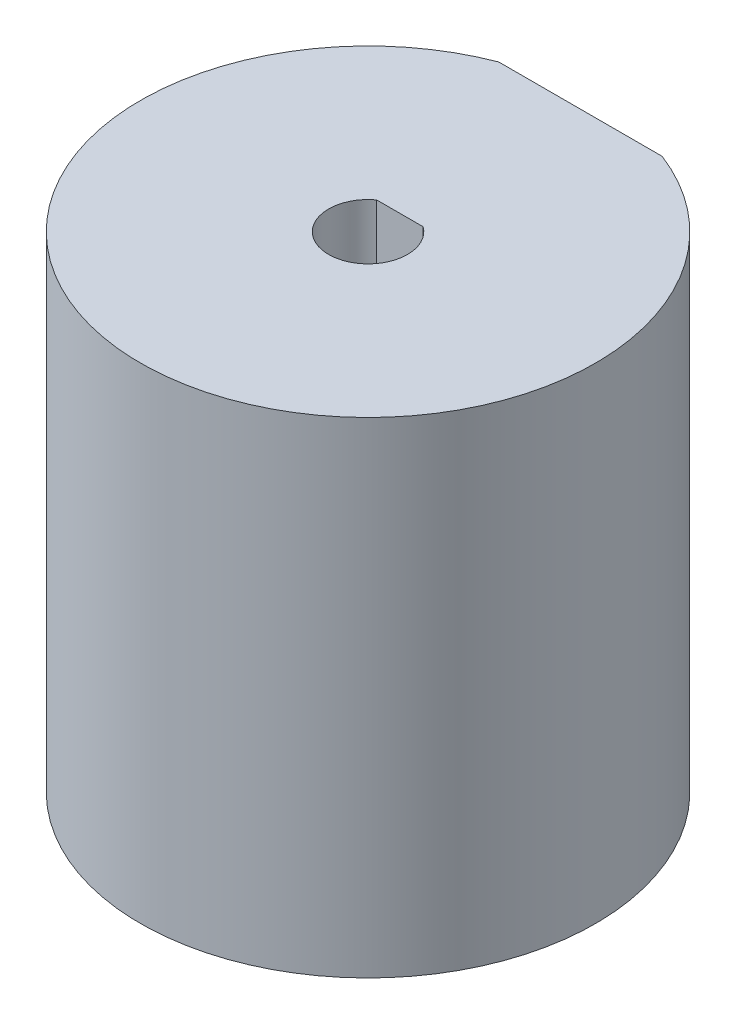
ISO-10303-21;
HEADER;
FILE_DESCRIPTION(('STEP AP214'),'2;1');
FILE_NAME('part.step','',(''),(''),'','','');
FILE_SCHEMA(('AUTOMOTIVE_DESIGN { 1 0 10303 214 1 1 1 1 }'));
ENDSEC;
DATA;
#1=APPLICATION_CONTEXT('core data for automotive mechanical design processes');
#2=APPLICATION_PROTOCOL_DEFINITION('international standard','automotive_design',2000,#1);
#3=PRODUCT_CONTEXT('',#1,'mechanical');
#4=PRODUCT('Part','Part','',(#3));
#5=PRODUCT_RELATED_PRODUCT_CATEGORY('part','',(#4));
#6=PRODUCT_DEFINITION_FORMATION('','',#4);
#7=PRODUCT_DEFINITION_CONTEXT('part definition',#1,'design');
#8=PRODUCT_DEFINITION('design','',#6,#7);
#9=PRODUCT_DEFINITION_SHAPE('','',#8);
#10=(LENGTH_UNIT() NAMED_UNIT(*) SI_UNIT(.MILLI.,.METRE.));
#11=(NAMED_UNIT(*) PLANE_ANGLE_UNIT() SI_UNIT($,.RADIAN.));
#12=(NAMED_UNIT(*) SI_UNIT($,.STERADIAN.) SOLID_ANGLE_UNIT());
#13=UNCERTAINTY_MEASURE_WITH_UNIT(LENGTH_MEASURE(1.E-05),#10,'distance_accuracy_value','');
#14=(GEOMETRIC_REPRESENTATION_CONTEXT(3) GLOBAL_UNCERTAINTY_ASSIGNED_CONTEXT((#13)) GLOBAL_UNIT_ASSIGNED_CONTEXT((#10,
#11,#12)) REPRESENTATION_CONTEXT('',''));
#15=CARTESIAN_POINT('',(0.,0.,0.));
#16=DIRECTION('',(0.,0.,1.));
#17=DIRECTION('',(1.,0.,0.));
#18=AXIS2_PLACEMENT_3D('',#15,#16,#17);
#19=CARTESIAN_POINT('',(0.,-2.5,-1.1));
#20=DIRECTION('',(0.,0.,-1.));
#21=DIRECTION('',(-1.,0.,0.));
#22=AXIS2_PLACEMENT_3D('',#19,#20,#21);
#23=CYLINDRICAL_SURFACE('',#22,1.6);
#24=CARTESIAN_POINT('',(0.,-2.5,-2.1));
#25=DIRECTION('',(0.,0.,-1.));
#26=DIRECTION('',(-1.,0.,0.));
#27=AXIS2_PLACEMENT_3D('',#24,#25,#26);
#28=CIRCLE('',#27,1.6);
#29=CARTESIAN_POINT('',(-1.53297097167559,-2.95825756949558,-2.1));
#30=VERTEX_POINT('',#29);
#31=CARTESIAN_POINT('',(1.53297097167559,-2.95825756949558,-2.1));
#32=VERTEX_POINT('',#31);
#33=EDGE_CURVE('E118',#30,#32,#28,.F.);
#34=ORIENTED_EDGE('',*,*,#33,.T.);
#35=CARTESIAN_POINT('',(1.53297097167559,-2.95825756949558,-2.1));
#36=CARTESIAN_POINT('',(1.54352604971187,-2.92294277650061,-2.09229272245643));
#37=CARTESIAN_POINT('',(1.55290301607243,-2.88712669403318,-2.08532865621752));
#38=CARTESIAN_POINT('',(1.56920034496131,-2.81463580797291,-2.07309299418957));
#39=CARTESIAN_POINT('',(1.57611926253637,-2.77796051275257,-2.06782239407064));
#40=CARTESIAN_POINT('',(1.59266855904081,-2.66924419230056,-2.05514314988246));
#41=CARTESIAN_POINT('',(1.59876147888326,-2.59627664989198,-2.05036122601527));
#42=CARTESIAN_POINT('',(1.60042058239588,-2.48300068282727,-2.04905949733274));
#43=CARTESIAN_POINT('',(1.59948109076205,-2.44271373665959,-2.04979705662415));
#44=CARTESIAN_POINT('',(1.59457907462669,-2.36240256378808,-2.05361367963773));
#45=CARTESIAN_POINT('',(1.5906149828767,-2.32237848414101,-2.05669395727699));
#46=CARTESIAN_POINT('',(1.5795421687225,-2.24161055241428,-2.06521139890993));
#47=CARTESIAN_POINT('',(1.57232986576967,-2.2008893712361,-2.0707260665678));
#48=CARTESIAN_POINT('',(1.55488226138408,-2.120476482756,-2.08385505850354));
#49=CARTESIAN_POINT('',(1.54464930479004,-2.08078400280795,-2.09146775384516));
#50=CARTESIAN_POINT('',(1.53297097167559,-2.04174243050442,-2.1));
#51=B_SPLINE_CURVE_WITH_KNOTS('',3,(#35,#36,#37,#38,#39,#40,#41,#42,#43,#44,#45,#46,#47,#48,#49,
#50),.UNSPECIFIED.,.F.,.F.,(4,2,2,2,2,2,2,4),(0.,0.112906588055111,0.225879438358299,
0.444746434931626,0.565508297489338,0.686332777410956,0.811317666956803,0.936205788655623),.UNSPECIFIED.);
#52=CARTESIAN_POINT('',(1.53297097167559,-2.04174243050441,-2.1));
#53=VERTEX_POINT('',#52);
#54=EDGE_CURVE('E51',#32,#53,#51,.T.);
#55=ORIENTED_EDGE('',*,*,#54,.T.);
#56=CARTESIAN_POINT('',(-1.53297097167559,-2.04174243050441,-2.1));
#57=VERTEX_POINT('',#56);
#58=EDGE_CURVE('E109',#53,#57,#28,.F.);
#59=ORIENTED_EDGE('',*,*,#58,.T.);
#60=CARTESIAN_POINT('',(-1.53297097167559,-2.04174243050441,-2.1));
#61=CARTESIAN_POINT('',(-1.54352604971187,-2.07705722349938,-2.09229272245643));
#62=CARTESIAN_POINT('',(-1.55290301607243,-2.11287330596682,-2.08532865621752));
#63=CARTESIAN_POINT('',(-1.56920034496131,-2.18536419202708,-2.07309299418958));
#64=CARTESIAN_POINT('',(-1.57611926253637,-2.22203948724742,-2.06782239407064));
#65=CARTESIAN_POINT('',(-1.59266855904081,-2.33075580769943,-2.05514314988247));
#66=CARTESIAN_POINT('',(-1.59876147888326,-2.40372335010801,-2.05036122601527));
#67=CARTESIAN_POINT('',(-1.60042058239588,-2.51699931717272,-2.04905949733274));
#68=CARTESIAN_POINT('',(-1.59948109076205,-2.5572862633404,-2.04979705662415));
#69=CARTESIAN_POINT('',(-1.59457907462669,-2.63759743621192,-2.05361367963773));
#70=CARTESIAN_POINT('',(-1.5906149828767,-2.67762151585898,-2.05669395727699));
#71=CARTESIAN_POINT('',(-1.5795421687225,-2.75838944758571,-2.06521139890993));
#72=CARTESIAN_POINT('',(-1.57232986576967,-2.7991106287639,-2.0707260665678));
#73=CARTESIAN_POINT('',(-1.55488226138408,-2.879523517244,-2.08385505850354));
#74=CARTESIAN_POINT('',(-1.54464930479004,-2.91921599719205,-2.09146775384516));
#75=CARTESIAN_POINT('',(-1.53297097167559,-2.95825756949558,-2.1));
#76=B_SPLINE_CURVE_WITH_KNOTS('',3,(#60,#61,#62,#63,#64,#65,#66,#67,#68,#69,#70,#71,#72,#73,#74,
#75),.UNSPECIFIED.,.F.,.F.,(4,2,2,2,2,2,2,4),(0.,0.112906588055112,0.225879438358298,
0.444746434931625,0.565508297489338,0.686332777410958,0.811317666956805,0.936205788655627),.UNSPECIFIED.);
#77=EDGE_CURVE('E112',#57,#30,#76,.T.);
#78=ORIENTED_EDGE('',*,*,#77,.T.);
#79=EDGE_LOOP('',(#34,#55,#59,#78));
#80=FACE_BOUND('',#79,.T.);
#81=CARTESIAN_POINT('',(0.,-2.5,-7.));
#82=DIRECTION('',(0.,0.,-1.));
#83=DIRECTION('',(-1.,0.,0.));
#84=AXIS2_PLACEMENT_3D('',#81,#82,#83);
#85=CIRCLE('',#84,1.6);
#86=CARTESIAN_POINT('',(-1.6,-2.5,-7.));
#87=VERTEX_POINT('',#86);
#88=EDGE_CURVE('E39',#87,#87,#85,.T.);
#89=ORIENTED_EDGE('',*,*,#88,.T.);
#90=EDGE_LOOP('',(#89));
#91=FACE_BOUND('',#90,.T.);
#92=ADVANCED_FACE('F35',(#80,#91),#23,.F.);
#93=CARTESIAN_POINT('',(0.,0.,0.));
#94=DIRECTION('',(0.,1.,0.));
#95=DIRECTION('',(0.,0.,1.));
#96=AXIS2_PLACEMENT_3D('',#93,#94,#95);
#97=CYLINDRICAL_SURFACE('',#96,2.6);
#98=ORIENTED_EDGE('',*,*,#54,.F.);
#99=DIRECTION('',(0.,1.,0.));
#100=VECTOR('',#99,1.);
#101=CARTESIAN_POINT('',(1.53297097167559,0.,-2.1));
#102=LINE('',#101,#100);
#103=CARTESIAN_POINT('',(1.53297097167559,-10.,-2.1));
#104=VERTEX_POINT('',#103);
#105=EDGE_CURVE('E131',#104,#32,#102,.T.);
#106=ORIENTED_EDGE('',*,*,#105,.F.);
#107=CARTESIAN_POINT('',(0.,-10.,0.));
#108=DIRECTION('',(0.,1.,0.));
#109=DIRECTION('',(0.,0.,1.));
#110=AXIS2_PLACEMENT_3D('',#107,#108,#109);
#111=CIRCLE('',#110,2.6);
#112=CARTESIAN_POINT('',(-1.53297097167559,-10.,-2.1));
#113=VERTEX_POINT('',#112);
#114=EDGE_CURVE('E146',#113,#104,#111,.T.);
#115=ORIENTED_EDGE('',*,*,#114,.F.);
#116=DIRECTION('',(0.,1.,0.));
#117=VECTOR('',#116,1.);
#118=CARTESIAN_POINT('',(-1.53297097167559,0.,-2.1));
#119=LINE('',#118,#117);
#120=EDGE_CURVE('E44',#113,#30,#119,.T.);
#121=ORIENTED_EDGE('',*,*,#120,.T.);
#122=ORIENTED_EDGE('',*,*,#77,.F.);
#123=CARTESIAN_POINT('',(-1.53297097167559,5.,-2.1));
#124=VERTEX_POINT('',#123);
#125=EDGE_CURVE('E123',#57,#124,#119,.T.);
#126=ORIENTED_EDGE('',*,*,#125,.T.);
#127=CARTESIAN_POINT('',(0.,5.,0.));
#128=DIRECTION('',(0.,1.,0.));
#129=DIRECTION('',(0.,0.,1.));
#130=AXIS2_PLACEMENT_3D('',#127,#128,#129);
#131=CIRCLE('',#130,2.6);
#132=CARTESIAN_POINT('',(1.53297097167559,5.,-2.1));
#133=VERTEX_POINT('',#132);
#134=EDGE_CURVE('E138',#124,#133,#131,.T.);
#135=ORIENTED_EDGE('',*,*,#134,.T.);
#136=EDGE_CURVE('E134',#53,#133,#102,.T.);
#137=ORIENTED_EDGE('',*,*,#136,.F.);
#138=EDGE_LOOP('',(#98,#106,#115,#121,#122,#126,#135,#137));
#139=FACE_BOUND('',#138,.T.);
#140=ADVANCED_FACE('F121',(#139),#97,.F.);
#141=CARTESIAN_POINT('',(1.53297097167559,0.,-2.1));
#142=DIRECTION('',(0.,0.,-1.));
#143=DIRECTION('',(-1.,0.,0.));
#144=AXIS2_PLACEMENT_3D('',#141,#142,#143);
#145=PLANE('',#144);
#146=ORIENTED_EDGE('',*,*,#33,.F.);
#147=ORIENTED_EDGE('',*,*,#120,.F.);
#148=DIRECTION('',(-1.,0.,0.));
#149=VECTOR('',#148,1.);
#150=CARTESIAN_POINT('',(1.53297097167559,-10.,-2.1));
#151=LINE('',#150,#149);
#152=EDGE_CURVE('E143',#104,#113,#151,.T.);
#153=ORIENTED_EDGE('',*,*,#152,.F.);
#154=ORIENTED_EDGE('',*,*,#105,.T.);
#155=EDGE_LOOP('',(#146,#147,#153,#154));
#156=FACE_BOUND('',#155,.T.);
#157=ADVANCED_FACE('F239',(#156),#145,.F.);
#158=CARTESIAN_POINT('',(0.,-10.,0.));
#159=DIRECTION('',(0.,1.,0.));
#160=DIRECTION('',(0.,0.,1.));
#161=AXIS2_PLACEMENT_3D('',#158,#159,#160);
#162=CYLINDRICAL_SURFACE('',#161,15.);
#163=CARTESIAN_POINT('',(0.,5.,0.));
#164=DIRECTION('',(0.,1.,0.));
#165=DIRECTION('',(0.,0.,1.));
#166=AXIS2_PLACEMENT_3D('',#163,#164,#165);
#167=CIRCLE('',#166,15.);
#168=CARTESIAN_POINT('',(-5.38516480713451,5.,-14.));
#169=VERTEX_POINT('',#168);
#170=CARTESIAN_POINT('',(5.38516480713451,5.,-14.));
#171=VERTEX_POINT('',#170);
#172=EDGE_CURVE('E140',#169,#171,#167,.T.);
#173=ORIENTED_EDGE('',*,*,#172,.F.);
#174=DIRECTION('',(0.,1.,0.));
#175=VECTOR('',#174,1.);
#176=CARTESIAN_POINT('',(-5.38516480713451,-46.,-14.));
#177=LINE('',#176,#175);
#178=CARTESIAN_POINT('',(-5.38516480713451,-27.,-14.));
#179=VERTEX_POINT('',#178);
#180=EDGE_CURVE('E174',#179,#169,#177,.T.);
#181=ORIENTED_EDGE('',*,*,#180,.F.);
#182=CARTESIAN_POINT('',(0.,-27.,0.));
#183=DIRECTION('',(0.,-1.,0.));
#184=DIRECTION('',(0.,0.,-1.));
#185=AXIS2_PLACEMENT_3D('',#182,#183,#184);
#186=CIRCLE('',#185,15.);
#187=CARTESIAN_POINT('',(5.38516480713451,-27.,-14.));
#188=VERTEX_POINT('',#187);
#189=EDGE_CURVE('E149',#188,#179,#186,.T.);
#190=ORIENTED_EDGE('',*,*,#189,.F.);
#191=DIRECTION('',(0.,1.,0.));
#192=VECTOR('',#191,1.);
#193=CARTESIAN_POINT('',(5.38516480713451,-46.,-14.));
#194=LINE('',#193,#192);
#195=EDGE_CURVE('E59',#188,#171,#194,.T.);
#196=ORIENTED_EDGE('',*,*,#195,.T.);
#197=EDGE_LOOP('',(#173,#181,#190,#196));
#198=FACE_BOUND('',#197,.T.);
#199=ADVANCED_FACE('F237',(#198),#162,.T.);
#200=CARTESIAN_POINT('',(0.,5.,0.));
#201=DIRECTION('',(0.,1.,0.));
#202=DIRECTION('',(0.,0.,1.));
#203=AXIS2_PLACEMENT_3D('',#200,#201,#202);
#204=PLANE('',#203);
#205=ORIENTED_EDGE('',*,*,#134,.F.);
#206=DIRECTION('',(-1.,0.,0.));
#207=VECTOR('',#206,1.);
#208=CARTESIAN_POINT('',(1.53297097167559,5.,-2.1));
#209=LINE('',#208,#207);
#210=EDGE_CURVE('E129',#133,#124,#209,.T.);
#211=ORIENTED_EDGE('',*,*,#210,.F.);
#212=EDGE_LOOP('',(#205,#211));
#213=FACE_BOUND('',#212,.T.);
#214=ORIENTED_EDGE('',*,*,#172,.T.);
#215=DIRECTION('',(-1.,0.,0.));
#216=VECTOR('',#215,1.);
#217=CARTESIAN_POINT('',(0.,5.,-14.));
#218=LINE('',#217,#216);
#219=EDGE_CURVE('E183',#171,#169,#218,.T.);
#220=ORIENTED_EDGE('',*,*,#219,.T.);
#221=EDGE_LOOP('',(#214,#220));
#222=FACE_BOUND('',#221,.T.);
#223=ADVANCED_FACE('F37',(#213,#222),#204,.T.);
#224=CARTESIAN_POINT('',(0.,-27.,0.));
#225=DIRECTION('',(0.,-1.,0.));
#226=DIRECTION('',(0.,0.,-1.));
#227=AXIS2_PLACEMENT_3D('',#224,#225,#226);
#228=PLANE('',#227);
#229=DIRECTION('',(1.,0.,0.));
#230=VECTOR('',#229,1.);
#231=CARTESIAN_POINT('',(8.,-27.,-8.));
#232=LINE('',#231,#230);
#233=CARTESIAN_POINT('',(-8.,-27.,-8.));
#234=VERTEX_POINT('',#233);
#235=CARTESIAN_POINT('',(8.,-27.,-8.));
#236=VERTEX_POINT('',#235);
#237=EDGE_CURVE('E179',#234,#236,#232,.T.);
#238=ORIENTED_EDGE('',*,*,#237,.F.);
#239=DIRECTION('',(0.,0.,-1.));
#240=VECTOR('',#239,1.);
#241=CARTESIAN_POINT('',(-8.,-27.,8.));
#242=LINE('',#241,#240);
#243=CARTESIAN_POINT('',(-8.,-27.,8.));
#244=VERTEX_POINT('',#243);
#245=EDGE_CURVE('E167',#244,#234,#242,.T.);
#246=ORIENTED_EDGE('',*,*,#245,.F.);
#247=DIRECTION('',(-1.,0.,0.));
#248=VECTOR('',#247,1.);
#249=CARTESIAN_POINT('',(8.,-27.,8.));
#250=LINE('',#249,#248);
#251=CARTESIAN_POINT('',(8.,-27.,8.));
#252=VERTEX_POINT('',#251);
#253=EDGE_CURVE('E164',#252,#244,#250,.T.);
#254=ORIENTED_EDGE('',*,*,#253,.F.);
#255=DIRECTION('',(0.,0.,1.));
#256=VECTOR('',#255,1.);
#257=CARTESIAN_POINT('',(8.,-27.,8.));
#258=LINE('',#257,#256);
#259=EDGE_CURVE('E176',#236,#252,#258,.T.);
#260=ORIENTED_EDGE('',*,*,#259,.F.);
#261=EDGE_LOOP('',(#238,#246,#254,#260));
#262=FACE_BOUND('',#261,.T.);
#263=ORIENTED_EDGE('',*,*,#189,.T.);
#264=DIRECTION('',(1.,0.,0.));
#265=VECTOR('',#264,1.);
#266=CARTESIAN_POINT('',(0.,-27.,-14.));
#267=LINE('',#266,#265);
#268=EDGE_CURVE('E12',#179,#188,#267,.T.);
#269=ORIENTED_EDGE('',*,*,#268,.T.);
#270=EDGE_LOOP('',(#263,#269));
#271=FACE_BOUND('',#270,.T.);
#272=ADVANCED_FACE('F227',(#262,#271),#228,.T.);
#273=ORIENTED_EDGE('',*,*,#58,.F.);
#274=ORIENTED_EDGE('',*,*,#136,.T.);
#275=ORIENTED_EDGE('',*,*,#210,.T.);
#276=ORIENTED_EDGE('',*,*,#125,.F.);
#277=EDGE_LOOP('',(#273,#274,#275,#276));
#278=FACE_BOUND('',#277,.T.);
#279=ADVANCED_FACE('F127',(#278),#145,.F.);
#280=CARTESIAN_POINT('',(0.,-10.,0.));
#281=DIRECTION('',(0.,-1.,0.));
#282=DIRECTION('',(0.,0.,-1.));
#283=AXIS2_PLACEMENT_3D('',#280,#281,#282);
#284=PLANE('',#283);
#285=ORIENTED_EDGE('',*,*,#114,.T.);
#286=ORIENTED_EDGE('',*,*,#152,.T.);
#287=EDGE_LOOP('',(#285,#286));
#288=FACE_BOUND('',#287,.T.);
#289=ADVANCED_FACE('F225',(#288),#284,.F.);
#290=CARTESIAN_POINT('',(-8.,-27.,8.));
#291=DIRECTION('',(1.,0.,0.));
#292=DIRECTION('',(0.,0.,-1.));
#293=AXIS2_PLACEMENT_3D('',#290,#291,#292);
#294=PLANE('',#293);
#295=DIRECTION('',(0.,0.,-1.));
#296=VECTOR('',#295,1.);
#297=CARTESIAN_POINT('',(-8.,-12.,8.));
#298=LINE('',#297,#296);
#299=CARTESIAN_POINT('',(-8.,-12.,8.));
#300=VERTEX_POINT('',#299);
#301=CARTESIAN_POINT('',(-8.,-12.,-8.));
#302=VERTEX_POINT('',#301);
#303=EDGE_CURVE('E172',#300,#302,#298,.T.);
#304=ORIENTED_EDGE('',*,*,#303,.F.);
#305=DIRECTION('',(0.,1.,0.));
#306=VECTOR('',#305,1.);
#307=CARTESIAN_POINT('',(-8.,-27.,8.));
#308=LINE('',#307,#306);
#309=EDGE_CURVE('E161',#244,#300,#308,.T.);
#310=ORIENTED_EDGE('',*,*,#309,.F.);
#311=ORIENTED_EDGE('',*,*,#245,.T.);
#312=DIRECTION('',(0.,1.,0.));
#313=VECTOR('',#312,1.);
#314=CARTESIAN_POINT('',(-8.,-27.,-8.));
#315=LINE('',#314,#313);
#316=EDGE_CURVE('E152',#234,#302,#315,.T.);
#317=ORIENTED_EDGE('',*,*,#316,.T.);
#318=EDGE_LOOP('',(#304,#310,#311,#317));
#319=FACE_BOUND('',#318,.T.);
#320=ADVANCED_FACE('F221',(#319),#294,.T.);
#321=CARTESIAN_POINT('',(8.,-27.,-8.));
#322=DIRECTION('',(0.,0.,1.));
#323=DIRECTION('',(1.,0.,0.));
#324=AXIS2_PLACEMENT_3D('',#321,#322,#323);
#325=PLANE('',#324);
#326=DIRECTION('',(1.,0.,0.));
#327=VECTOR('',#326,1.);
#328=CARTESIAN_POINT('',(8.,-12.,-8.));
#329=LINE('',#328,#327);
#330=CARTESIAN_POINT('',(8.,-12.,-8.));
#331=VERTEX_POINT('',#330);
#332=EDGE_CURVE('E170',#302,#331,#329,.T.);
#333=ORIENTED_EDGE('',*,*,#332,.F.);
#334=ORIENTED_EDGE('',*,*,#316,.F.);
#335=ORIENTED_EDGE('',*,*,#237,.T.);
#336=DIRECTION('',(0.,1.,0.));
#337=VECTOR('',#336,1.);
#338=CARTESIAN_POINT('',(8.,-27.,-8.));
#339=LINE('',#338,#337);
#340=EDGE_CURVE('E155',#236,#331,#339,.T.);
#341=ORIENTED_EDGE('',*,*,#340,.T.);
#342=EDGE_LOOP('',(#333,#334,#335,#341));
#343=FACE_BOUND('',#342,.T.);
#344=ADVANCED_FACE('F217',(#343),#325,.T.);
#345=CARTESIAN_POINT('',(8.,-27.,8.));
#346=DIRECTION('',(-1.,0.,0.));
#347=DIRECTION('',(0.,0.,1.));
#348=AXIS2_PLACEMENT_3D('',#345,#346,#347);
#349=PLANE('',#348);
#350=DIRECTION('',(0.,0.,1.));
#351=VECTOR('',#350,1.);
#352=CARTESIAN_POINT('',(8.,-12.,8.));
#353=LINE('',#352,#351);
#354=CARTESIAN_POINT('',(8.,-12.,8.));
#355=VERTEX_POINT('',#354);
#356=EDGE_CURVE('E168',#331,#355,#353,.T.);
#357=ORIENTED_EDGE('',*,*,#356,.F.);
#358=ORIENTED_EDGE('',*,*,#340,.F.);
#359=ORIENTED_EDGE('',*,*,#259,.T.);
#360=DIRECTION('',(0.,1.,0.));
#361=VECTOR('',#360,1.);
#362=CARTESIAN_POINT('',(8.,-27.,8.));
#363=LINE('',#362,#361);
#364=EDGE_CURVE('E158',#252,#355,#363,.T.);
#365=ORIENTED_EDGE('',*,*,#364,.T.);
#366=EDGE_LOOP('',(#357,#358,#359,#365));
#367=FACE_BOUND('',#366,.T.);
#368=ADVANCED_FACE('F213',(#367),#349,.T.);
#369=CARTESIAN_POINT('',(8.,-27.,8.));
#370=DIRECTION('',(0.,0.,-1.));
#371=DIRECTION('',(-1.,0.,0.));
#372=AXIS2_PLACEMENT_3D('',#369,#370,#371);
#373=PLANE('',#372);
#374=DIRECTION('',(-1.,0.,0.));
#375=VECTOR('',#374,1.);
#376=CARTESIAN_POINT('',(8.,-12.,8.));
#377=LINE('',#376,#375);
#378=EDGE_CURVE('E165',#355,#300,#377,.T.);
#379=ORIENTED_EDGE('',*,*,#378,.F.);
#380=ORIENTED_EDGE('',*,*,#364,.F.);
#381=ORIENTED_EDGE('',*,*,#253,.T.);
#382=ORIENTED_EDGE('',*,*,#309,.T.);
#383=EDGE_LOOP('',(#379,#380,#381,#382));
#384=FACE_BOUND('',#383,.T.);
#385=ADVANCED_FACE('F210',(#384),#373,.T.);
#386=CARTESIAN_POINT('',(0.,-12.,0.));
#387=DIRECTION('',(0.,-1.,0.));
#388=DIRECTION('',(0.,0.,-1.));
#389=AXIS2_PLACEMENT_3D('',#386,#387,#388);
#390=PLANE('',#389);
#391=ORIENTED_EDGE('',*,*,#303,.T.);
#392=ORIENTED_EDGE('',*,*,#332,.T.);
#393=ORIENTED_EDGE('',*,*,#356,.T.);
#394=ORIENTED_EDGE('',*,*,#378,.T.);
#395=EDGE_LOOP('',(#391,#392,#393,#394));
#396=FACE_BOUND('',#395,.T.);
#397=ADVANCED_FACE('F208',(#396),#390,.T.);
#398=CARTESIAN_POINT('',(0.,-46.,-14.));
#399=DIRECTION('',(0.,0.,-1.));
#400=DIRECTION('',(-1.,0.,0.));
#401=AXIS2_PLACEMENT_3D('',#398,#399,#400);
#402=PLANE('',#401);
#403=CARTESIAN_POINT('',(0.,-2.5,-14.));
#404=DIRECTION('',(0.,0.,-1.));
#405=DIRECTION('',(-1.,0.,0.));
#406=AXIS2_PLACEMENT_3D('',#403,#404,#405);
#407=CIRCLE('',#406,2.6);
#408=CARTESIAN_POINT('',(-2.6,-2.5,-14.));
#409=VERTEX_POINT('',#408);
#410=EDGE_CURVE('E251',#409,#409,#407,.T.);
#411=ORIENTED_EDGE('',*,*,#410,.F.);
#412=EDGE_LOOP('',(#411));
#413=FACE_BOUND('',#412,.T.);
#414=ORIENTED_EDGE('',*,*,#180,.T.);
#415=ORIENTED_EDGE('',*,*,#219,.F.);
#416=ORIENTED_EDGE('',*,*,#195,.F.);
#417=ORIENTED_EDGE('',*,*,#268,.F.);
#418=EDGE_LOOP('',(#414,#415,#416,#417));
#419=FACE_BOUND('',#418,.T.);
#420=ADVANCED_FACE('F204',(#413,#419),#402,.T.);
#421=CARTESIAN_POINT('',(0.,-2.5,-7.));
#422=DIRECTION('',(0.,0.,-1.));
#423=DIRECTION('',(-1.,0.,0.));
#424=AXIS2_PLACEMENT_3D('',#421,#422,#423);
#425=CYLINDRICAL_SURFACE('',#424,2.6);
#426=CARTESIAN_POINT('',(0.,-2.5,-7.));
#427=DIRECTION('',(0.,0.,-1.));
#428=DIRECTION('',(-1.,0.,0.));
#429=AXIS2_PLACEMENT_3D('',#426,#427,#428);
#430=CIRCLE('',#429,2.6);
#431=CARTESIAN_POINT('',(-2.6,-2.5,-7.));
#432=VERTEX_POINT('',#431);
#433=EDGE_CURVE('E254',#432,#432,#430,.T.);
#434=ORIENTED_EDGE('',*,*,#433,.F.);
#435=EDGE_LOOP('',(#434));
#436=FACE_BOUND('',#435,.T.);
#437=ORIENTED_EDGE('',*,*,#410,.T.);
#438=EDGE_LOOP('',(#437));
#439=FACE_BOUND('',#438,.T.);
#440=ADVANCED_FACE('F202',(#436,#439),#425,.F.);
#441=CARTESIAN_POINT('',(0.,-2.5,-7.));
#442=DIRECTION('',(0.,0.,-1.));
#443=DIRECTION('',(-1.,0.,0.));
#444=AXIS2_PLACEMENT_3D('',#441,#442,#443);
#445=PLANE('',#444);
#446=ORIENTED_EDGE('',*,*,#88,.F.);
#447=EDGE_LOOP('',(#446));
#448=FACE_BOUND('',#447,.T.);
#449=ORIENTED_EDGE('',*,*,#433,.T.);
#450=EDGE_LOOP('',(#449));
#451=FACE_BOUND('',#450,.T.);
#452=ADVANCED_FACE('F261',(#448,#451),#445,.T.);
#453=CLOSED_SHELL('',(#92,#140,#157,#199,#223,#272,#279,#289,#320,#344,#368,#385,#397,#420,#440,#452));
#454=MANIFOLD_SOLID_BREP('B2',#453);
#455=ADVANCED_BREP_SHAPE_REPRESENTATION('',(#18,#454),#14);
#456=SHAPE_DEFINITION_REPRESENTATION(#9,#455);
ENDSEC;
END-ISO-10303-21;
